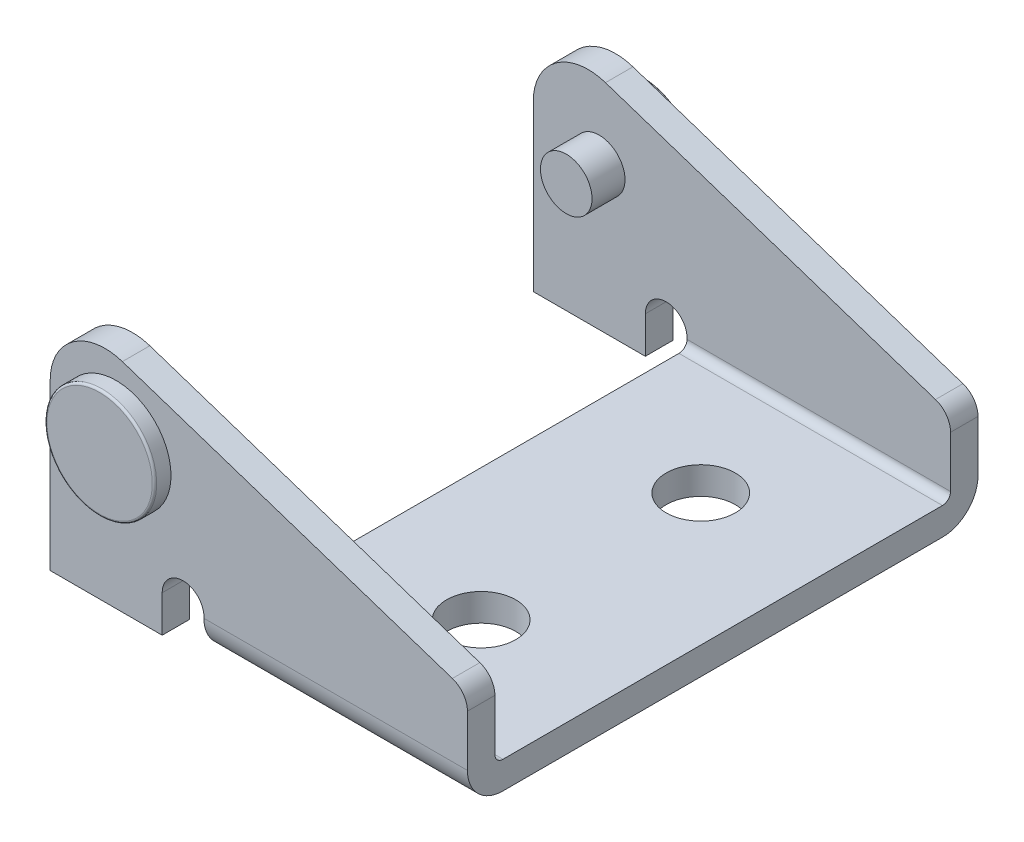
ISO-10303-21;
HEADER;
FILE_DESCRIPTION(('STEP AP214'),'2;1');
FILE_NAME('part.step','',(''),(''),'','','');
FILE_SCHEMA(('AUTOMOTIVE_DESIGN { 1 0 10303 214 1 1 1 1 }'));
ENDSEC;
DATA;
#1=APPLICATION_CONTEXT('core data for automotive mechanical design processes');
#2=APPLICATION_PROTOCOL_DEFINITION('international standard','automotive_design',2000,#1);
#3=PRODUCT_CONTEXT('',#1,'mechanical');
#4=PRODUCT('Part','Part','',(#3));
#5=PRODUCT_RELATED_PRODUCT_CATEGORY('part','',(#4));
#6=PRODUCT_DEFINITION_FORMATION('','',#4);
#7=PRODUCT_DEFINITION_CONTEXT('part definition',#1,'design');
#8=PRODUCT_DEFINITION('design','',#6,#7);
#9=PRODUCT_DEFINITION_SHAPE('','',#8);
#10=(LENGTH_UNIT() NAMED_UNIT(*) SI_UNIT(.MILLI.,.METRE.));
#11=(NAMED_UNIT(*) PLANE_ANGLE_UNIT() SI_UNIT($,.RADIAN.));
#12=(NAMED_UNIT(*) SI_UNIT($,.STERADIAN.) SOLID_ANGLE_UNIT());
#13=UNCERTAINTY_MEASURE_WITH_UNIT(LENGTH_MEASURE(1.E-05),#10,'distance_accuracy_value','');
#14=(GEOMETRIC_REPRESENTATION_CONTEXT(3) GLOBAL_UNCERTAINTY_ASSIGNED_CONTEXT((#13)) GLOBAL_UNIT_ASSIGNED_CONTEXT((#10,
#11,#12)) REPRESENTATION_CONTEXT('',''));
#15=CARTESIAN_POINT('',(0.,0.,0.));
#16=DIRECTION('',(0.,0.,1.));
#17=DIRECTION('',(1.,0.,0.));
#18=AXIS2_PLACEMENT_3D('',#15,#16,#17);
#19=CARTESIAN_POINT('',(-6.,-9.763,-20.013));
#20=DIRECTION('',(1.,0.,0.));
#21=DIRECTION('',(0.,0.,-1.));
#22=AXIS2_PLACEMENT_3D('',#19,#20,#21);
#23=PLANE('',#22);
#24=DIRECTION('',(0.,0.,-1.));
#25=VECTOR('',#24,1.);
#26=CARTESIAN_POINT('',(-6.,-13.,23.25));
#27=LINE('',#26,#25);
#28=CARTESIAN_POINT('',(-6.,-13.,-20.75));
#29=VERTEX_POINT('',#28);
#30=CARTESIAN_POINT('',(-6.,-13.,-23.25));
#31=VERTEX_POINT('',#30);
#32=EDGE_CURVE('E216',#29,#31,#27,.T.);
#33=ORIENTED_EDGE('',*,*,#32,.F.);
#34=DIRECTION('',(0.,-1.,0.));
#35=VECTOR('',#34,1.);
#36=CARTESIAN_POINT('',(-6.,7.03,-20.75));
#37=LINE('',#36,#35);
#38=CARTESIAN_POINT('',(-6.,2.024,-20.75));
#39=VERTEX_POINT('',#38);
#40=EDGE_CURVE('E222',#39,#29,#37,.T.);
#41=ORIENTED_EDGE('',*,*,#40,.F.);
#42=DIRECTION('',(0.,0.,-1.));
#43=VECTOR('',#42,1.);
#44=CARTESIAN_POINT('',(-6.,2.024,23.25));
#45=LINE('',#44,#43);
#46=CARTESIAN_POINT('',(-6.,2.024,-23.25));
#47=VERTEX_POINT('',#46);
#48=EDGE_CURVE('E246',#47,#39,#45,.F.);
#49=ORIENTED_EDGE('',*,*,#48,.F.);
#50=DIRECTION('',(0.,1.,0.));
#51=VECTOR('',#50,1.);
#52=CARTESIAN_POINT('',(-6.,-13.,-23.25));
#53=LINE('',#52,#51);
#54=EDGE_CURVE('E219',#31,#47,#53,.T.);
#55=ORIENTED_EDGE('',*,*,#54,.F.);
#56=EDGE_LOOP('',(#33,#41,#49,#55));
#57=FACE_BOUND('',#56,.T.);
#58=ADVANCED_FACE('F17',(#57),#23,.F.);
#59=DIRECTION('',(0.,1.,0.));
#60=VECTOR('',#59,1.);
#61=CARTESIAN_POINT('',(-6.,-9.763,20.75));
#62=LINE('',#61,#60);
#63=CARTESIAN_POINT('',(-6.,-13.,20.75));
#64=VERTEX_POINT('',#63);
#65=CARTESIAN_POINT('',(-6.,2.024,20.75));
#66=VERTEX_POINT('',#65);
#67=EDGE_CURVE('E224',#64,#66,#62,.T.);
#68=ORIENTED_EDGE('',*,*,#67,.F.);
#69=CARTESIAN_POINT('',(-6.,-13.,23.25));
#70=VERTEX_POINT('',#69);
#71=EDGE_CURVE('E199',#70,#64,#27,.T.);
#72=ORIENTED_EDGE('',*,*,#71,.F.);
#73=DIRECTION('',(0.,-1.,0.));
#74=VECTOR('',#73,1.);
#75=CARTESIAN_POINT('',(-6.,7.03,23.25));
#76=LINE('',#75,#74);
#77=CARTESIAN_POINT('',(-6.,2.024,23.25));
#78=VERTEX_POINT('',#77);
#79=EDGE_CURVE('E214',#78,#70,#76,.T.);
#80=ORIENTED_EDGE('',*,*,#79,.F.);
#81=DIRECTION('',(0.,0.,-1.));
#82=VECTOR('',#81,1.);
#83=CARTESIAN_POINT('',(-6.,2.024,23.25));
#84=LINE('',#83,#82);
#85=EDGE_CURVE('E348',#78,#66,#84,.T.);
#86=ORIENTED_EDGE('',*,*,#85,.T.);
#87=EDGE_LOOP('',(#68,#72,#80,#86));
#88=FACE_BOUND('',#87,.T.);
#89=ADVANCED_FACE('F405',(#88),#23,.F.);
#90=CARTESIAN_POINT('',(4.2,-13.,23.25));
#91=DIRECTION('',(0.,1.,0.));
#92=DIRECTION('',(0.,0.,1.));
#93=AXIS2_PLACEMENT_3D('',#90,#91,#92);
#94=PLANE('',#93);
#95=DIRECTION('',(1.,0.,0.));
#96=VECTOR('',#95,1.);
#97=CARTESIAN_POINT('',(4.2,-13.,-20.75));
#98=LINE('',#97,#96);
#99=CARTESIAN_POINT('',(4.2,-13.,-20.75));
#100=VERTEX_POINT('',#99);
#101=EDGE_CURVE('E200',#29,#100,#98,.T.);
#102=ORIENTED_EDGE('',*,*,#101,.F.);
#103=ORIENTED_EDGE('',*,*,#32,.T.);
#104=DIRECTION('',(-1.,0.,0.));
#105=VECTOR('',#104,1.);
#106=CARTESIAN_POINT('',(4.2,-13.,-23.25));
#107=LINE('',#106,#105);
#108=CARTESIAN_POINT('',(4.2,-13.,-23.25));
#109=VERTEX_POINT('',#108);
#110=EDGE_CURVE('E237',#109,#31,#107,.T.);
#111=ORIENTED_EDGE('',*,*,#110,.F.);
#112=DIRECTION('',(0.,0.,-1.));
#113=VECTOR('',#112,1.);
#114=CARTESIAN_POINT('',(4.2,-13.,23.25));
#115=LINE('',#114,#113);
#116=EDGE_CURVE('E207',#100,#109,#115,.T.);
#117=ORIENTED_EDGE('',*,*,#116,.F.);
#118=EDGE_LOOP('',(#102,#103,#111,#117));
#119=FACE_BOUND('',#118,.T.);
#120=ADVANCED_FACE('F442',(#119),#94,.F.);
#121=DIRECTION('',(-1.,0.,0.));
#122=VECTOR('',#121,1.);
#123=CARTESIAN_POINT('',(4.2,-13.,20.75));
#124=LINE('',#123,#122);
#125=CARTESIAN_POINT('',(4.2,-13.,20.75));
#126=VERTEX_POINT('',#125);
#127=EDGE_CURVE('E184',#126,#64,#124,.T.);
#128=ORIENTED_EDGE('',*,*,#127,.F.);
#129=CARTESIAN_POINT('',(4.2,-13.,23.25));
#130=VERTEX_POINT('',#129);
#131=EDGE_CURVE('E197',#130,#126,#115,.T.);
#132=ORIENTED_EDGE('',*,*,#131,.F.);
#133=DIRECTION('',(-1.,0.,0.));
#134=VECTOR('',#133,1.);
#135=CARTESIAN_POINT('',(4.2,-13.,23.25));
#136=LINE('',#135,#134);
#137=EDGE_CURVE('E240',#130,#70,#136,.T.);
#138=ORIENTED_EDGE('',*,*,#137,.T.);
#139=ORIENTED_EDGE('',*,*,#71,.T.);
#140=EDGE_LOOP('',(#128,#132,#138,#139));
#141=FACE_BOUND('',#140,.T.);
#142=ADVANCED_FACE('F195',(#141),#94,.F.);
#143=CARTESIAN_POINT('',(4.2,-9.763,-20.013));
#144=DIRECTION('',(1.,0.,0.));
#145=DIRECTION('',(0.,0.,-1.));
#146=AXIS2_PLACEMENT_3D('',#143,#144,#145);
#147=PLANE('',#146);
#148=DIRECTION('',(0.,1.,0.));
#149=VECTOR('',#148,1.);
#150=CARTESIAN_POINT('',(4.20000000000006,7.03,-20.75));
#151=LINE('',#150,#149);
#152=CARTESIAN_POINT('',(4.2,-9.647,-20.75));
#153=VERTEX_POINT('',#152);
#154=EDGE_CURVE('E32',#100,#153,#151,.T.);
#155=ORIENTED_EDGE('',*,*,#154,.F.);
#156=ORIENTED_EDGE('',*,*,#116,.T.);
#157=DIRECTION('',(0.,1.,0.));
#158=VECTOR('',#157,1.);
#159=CARTESIAN_POINT('',(4.2,-13.,-23.25));
#160=LINE('',#159,#158);
#161=CARTESIAN_POINT('',(4.2,-9.647,-23.25));
#162=VERTEX_POINT('',#161);
#163=EDGE_CURVE('E206',#109,#162,#160,.T.);
#164=ORIENTED_EDGE('',*,*,#163,.T.);
#165=DIRECTION('',(0.,0.,-1.));
#166=VECTOR('',#165,1.);
#167=CARTESIAN_POINT('',(4.2,-9.647,23.25));
#168=LINE('',#167,#166);
#169=EDGE_CURVE('E381',#153,#162,#168,.T.);
#170=ORIENTED_EDGE('',*,*,#169,.F.);
#171=EDGE_LOOP('',(#155,#156,#164,#170));
#172=FACE_BOUND('',#171,.T.);
#173=ADVANCED_FACE('F446',(#172),#147,.T.);
#174=ORIENTED_EDGE('',*,*,#131,.T.);
#175=DIRECTION('',(0.,-1.,0.));
#176=VECTOR('',#175,1.);
#177=CARTESIAN_POINT('',(4.2,-9.763,20.75));
#178=LINE('',#177,#176);
#179=CARTESIAN_POINT('',(4.2,-9.647,20.75));
#180=VERTEX_POINT('',#179);
#181=EDGE_CURVE('E180',#180,#126,#178,.T.);
#182=ORIENTED_EDGE('',*,*,#181,.F.);
#183=CARTESIAN_POINT('',(4.2,-9.647,23.25));
#184=VERTEX_POINT('',#183);
#185=EDGE_CURVE('E379',#184,#180,#168,.T.);
#186=ORIENTED_EDGE('',*,*,#185,.F.);
#187=DIRECTION('',(0.,-1.,0.));
#188=VECTOR('',#187,1.);
#189=CARTESIAN_POINT('',(4.2,7.03,23.25));
#190=LINE('',#189,#188);
#191=EDGE_CURVE('E204',#184,#130,#190,.T.);
#192=ORIENTED_EDGE('',*,*,#191,.T.);
#193=EDGE_LOOP('',(#174,#182,#186,#192));
#194=FACE_BOUND('',#193,.T.);
#195=ADVANCED_FACE('F203',(#194),#147,.T.);
#196=CARTESIAN_POINT('',(20.,-13.,10.));
#197=DIRECTION('',(0.,1.,0.));
#198=DIRECTION('',(1.,0.,0.));
#199=AXIS2_PLACEMENT_3D('',#196,#197,#198);
#200=CIRCLE('',#199,3.15);
#201=CARTESIAN_POINT('',(23.15,-13.,10.));
#202=VERTEX_POINT('',#201);
#203=EDGE_CURVE('E478',#202,#202,#200,.T.);
#204=ORIENTED_EDGE('',*,*,#203,.T.);
#205=EDGE_LOOP('',(#204));
#206=FACE_BOUND('',#205,.T.);
#207=CARTESIAN_POINT('',(20.,-13.,-10.));
#208=DIRECTION('',(0.,1.,0.));
#209=DIRECTION('',(1.,0.,0.));
#210=AXIS2_PLACEMENT_3D('',#207,#208,#209);
#211=CIRCLE('',#210,3.15);
#212=CARTESIAN_POINT('',(23.15,-13.,-10.));
#213=VERTEX_POINT('',#212);
#214=EDGE_CURVE('E201',#213,#213,#211,.T.);
#215=ORIENTED_EDGE('',*,*,#214,.T.);
#216=EDGE_LOOP('',(#215));
#217=FACE_BOUND('',#216,.T.);
#218=DIRECTION('',(-1.,0.,0.));
#219=VECTOR('',#218,1.);
#220=CARTESIAN_POINT('',(32.,-13.,20.013));
#221=LINE('',#220,#219);
#222=CARTESIAN_POINT('',(32.,-13.,20.013));
#223=VERTEX_POINT('',#222);
#224=CARTESIAN_POINT('',(8.,-13.,20.013));
#225=VERTEX_POINT('',#224);
#226=EDGE_CURVE('E314',#223,#225,#221,.T.);
#227=ORIENTED_EDGE('',*,*,#226,.T.);
#228=DIRECTION('',(0.,0.,-1.));
#229=VECTOR('',#228,1.);
#230=CARTESIAN_POINT('',(8.,-13.,23.25));
#231=LINE('',#230,#229);
#232=CARTESIAN_POINT('',(8.,-13.,-20.013));
#233=VERTEX_POINT('',#232);
#234=EDGE_CURVE('E373',#225,#233,#231,.T.);
#235=ORIENTED_EDGE('',*,*,#234,.T.);
#236=DIRECTION('',(-1.,0.,0.));
#237=VECTOR('',#236,1.);
#238=CARTESIAN_POINT('',(32.,-13.,-20.013));
#239=LINE('',#238,#237);
#240=CARTESIAN_POINT('',(32.,-13.,-20.013));
#241=VERTEX_POINT('',#240);
#242=EDGE_CURVE('E311',#241,#233,#239,.T.);
#243=ORIENTED_EDGE('',*,*,#242,.F.);
#244=DIRECTION('',(0.,0.,-1.));
#245=VECTOR('',#244,1.);
#246=CARTESIAN_POINT('',(32.,-13.,20.013));
#247=LINE('',#246,#245);
#248=EDGE_CURVE('E287',#223,#241,#247,.T.);
#249=ORIENTED_EDGE('',*,*,#248,.F.);
#250=EDGE_LOOP('',(#227,#235,#243,#249));
#251=FACE_BOUND('',#250,.T.);
#252=ADVANCED_FACE('F459',(#206,#217,#251),#94,.F.);
#253=CARTESIAN_POINT('',(4.2,-9.763,-20.013));
#254=DIRECTION('',(-1.,0.,0.));
#255=DIRECTION('',(0.,0.,1.));
#256=AXIS2_PLACEMENT_3D('',#253,#254,#255);
#257=CYLINDRICAL_SURFACE('',#256,0.737000000000002);
#258=CARTESIAN_POINT('',(8.,-9.763,-20.013));
#259=DIRECTION('',(1.,0.,0.));
#260=DIRECTION('',(0.,0.,-1.));
#261=AXIS2_PLACEMENT_3D('',#258,#259,#260);
#262=CIRCLE('',#261,0.737000000000002);
#263=CARTESIAN_POINT('',(8.,-10.5,-20.013));
#264=VERTEX_POINT('',#263);
#265=CARTESIAN_POINT('',(8.,-9.763,-20.75));
#266=VERTEX_POINT('',#265);
#267=EDGE_CURVE('E396',#264,#266,#262,.T.);
#268=ORIENTED_EDGE('',*,*,#267,.F.);
#269=DIRECTION('',(-1.,0.,0.));
#270=VECTOR('',#269,1.);
#271=CARTESIAN_POINT('',(4.2,-10.5,-20.013));
#272=LINE('',#271,#270);
#273=CARTESIAN_POINT('',(32.,-10.5,-20.013));
#274=VERTEX_POINT('',#273);
#275=EDGE_CURVE('E231',#274,#264,#272,.T.);
#276=ORIENTED_EDGE('',*,*,#275,.F.);
#277=CARTESIAN_POINT('',(32.,-9.763,-20.013));
#278=DIRECTION('',(1.,0.,0.));
#279=DIRECTION('',(0.,0.,-1.));
#280=AXIS2_PLACEMENT_3D('',#277,#278,#279);
#281=CIRCLE('',#280,0.737000000000002);
#282=CARTESIAN_POINT('',(32.,-9.763,-20.75));
#283=VERTEX_POINT('',#282);
#284=EDGE_CURVE('E296',#274,#283,#281,.T.);
#285=ORIENTED_EDGE('',*,*,#284,.T.);
#286=DIRECTION('',(-1.,0.,0.));
#287=VECTOR('',#286,1.);
#288=CARTESIAN_POINT('',(4.2,-9.763,-20.75));
#289=LINE('',#288,#287);
#290=EDGE_CURVE('E234',#283,#266,#289,.T.);
#291=ORIENTED_EDGE('',*,*,#290,.T.);
#292=EDGE_LOOP('',(#268,#276,#285,#291));
#293=FACE_BOUND('',#292,.T.);
#294=ADVANCED_FACE('F456',(#293),#257,.F.);
#295=CARTESIAN_POINT('',(4.2,-10.5,-20.013));
#296=DIRECTION('',(0.,-1.,0.));
#297=DIRECTION('',(0.,0.,-1.));
#298=AXIS2_PLACEMENT_3D('',#295,#296,#297);
#299=PLANE('',#298);
#300=CARTESIAN_POINT('',(20.,-10.5,10.));
#301=DIRECTION('',(0.,1.,0.));
#302=DIRECTION('',(1.,0.,0.));
#303=AXIS2_PLACEMENT_3D('',#300,#301,#302);
#304=CIRCLE('',#303,3.15);
#305=CARTESIAN_POINT('',(23.15,-10.5,10.));
#306=VERTEX_POINT('',#305);
#307=EDGE_CURVE('E515',#306,#306,#304,.T.);
#308=ORIENTED_EDGE('',*,*,#307,.F.);
#309=EDGE_LOOP('',(#308));
#310=FACE_BOUND('',#309,.T.);
#311=CARTESIAN_POINT('',(20.,-10.5,-10.));
#312=DIRECTION('',(0.,1.,0.));
#313=DIRECTION('',(1.,0.,0.));
#314=AXIS2_PLACEMENT_3D('',#311,#312,#313);
#315=CIRCLE('',#314,3.15);
#316=CARTESIAN_POINT('',(23.15,-10.5,-10.));
#317=VERTEX_POINT('',#316);
#318=EDGE_CURVE('E511',#317,#317,#315,.T.);
#319=ORIENTED_EDGE('',*,*,#318,.F.);
#320=EDGE_LOOP('',(#319));
#321=FACE_BOUND('',#320,.T.);
#322=ORIENTED_EDGE('',*,*,#275,.T.);
#323=DIRECTION('',(0.,0.,1.));
#324=VECTOR('',#323,1.);
#325=CARTESIAN_POINT('',(8.,-10.5,-20.013));
#326=LINE('',#325,#324);
#327=CARTESIAN_POINT('',(8.,-10.5,20.013));
#328=VERTEX_POINT('',#327);
#329=EDGE_CURVE('E393',#264,#328,#326,.T.);
#330=ORIENTED_EDGE('',*,*,#329,.T.);
#331=DIRECTION('',(-1.,0.,0.));
#332=VECTOR('',#331,1.);
#333=CARTESIAN_POINT('',(4.2,-10.5,20.013));
#334=LINE('',#333,#332);
#335=CARTESIAN_POINT('',(32.,-10.5,20.013));
#336=VERTEX_POINT('',#335);
#337=EDGE_CURVE('E228',#336,#328,#334,.T.);
#338=ORIENTED_EDGE('',*,*,#337,.F.);
#339=DIRECTION('',(0.,0.,1.));
#340=VECTOR('',#339,1.);
#341=CARTESIAN_POINT('',(32.,-10.5,-20.013));
#342=LINE('',#341,#340);
#343=EDGE_CURVE('E299',#274,#336,#342,.T.);
#344=ORIENTED_EDGE('',*,*,#343,.F.);
#345=EDGE_LOOP('',(#322,#330,#338,#344));
#346=FACE_BOUND('',#345,.T.);
#347=ADVANCED_FACE('F453',(#310,#321,#346),#299,.F.);
#348=CARTESIAN_POINT('',(4.2,-9.763,20.013));
#349=DIRECTION('',(-1.,0.,0.));
#350=DIRECTION('',(0.,0.,1.));
#351=AXIS2_PLACEMENT_3D('',#348,#349,#350);
#352=CYLINDRICAL_SURFACE('',#351,0.737000000000002);
#353=CARTESIAN_POINT('',(8.,-9.763,20.013));
#354=DIRECTION('',(1.,0.,0.));
#355=DIRECTION('',(0.,0.,-1.));
#356=AXIS2_PLACEMENT_3D('',#353,#354,#355);
#357=CIRCLE('',#356,0.737000000000002);
#358=CARTESIAN_POINT('',(8.,-9.763,20.75));
#359=VERTEX_POINT('',#358);
#360=EDGE_CURVE('E391',#359,#328,#357,.T.);
#361=ORIENTED_EDGE('',*,*,#360,.F.);
#362=DIRECTION('',(-1.,0.,0.));
#363=VECTOR('',#362,1.);
#364=CARTESIAN_POINT('',(4.2,-9.763,20.75));
#365=LINE('',#364,#363);
#366=CARTESIAN_POINT('',(32.,-9.763,20.75));
#367=VERTEX_POINT('',#366);
#368=EDGE_CURVE('E209',#367,#359,#365,.T.);
#369=ORIENTED_EDGE('',*,*,#368,.F.);
#370=CARTESIAN_POINT('',(32.,-9.763,20.013));
#371=DIRECTION('',(1.,0.,0.));
#372=DIRECTION('',(0.,0.,-1.));
#373=AXIS2_PLACEMENT_3D('',#370,#371,#372);
#374=CIRCLE('',#373,0.737000000000002);
#375=EDGE_CURVE('E302',#367,#336,#374,.T.);
#376=ORIENTED_EDGE('',*,*,#375,.T.);
#377=ORIENTED_EDGE('',*,*,#337,.T.);
#378=EDGE_LOOP('',(#361,#369,#376,#377));
#379=FACE_BOUND('',#378,.T.);
#380=ADVANCED_FACE('F420',(#379),#352,.F.);
#381=CARTESIAN_POINT('',(32.,-9.76299999999999,20.013));
#382=DIRECTION('',(1.,0.,0.));
#383=DIRECTION('',(0.,0.,-1.));
#384=AXIS2_PLACEMENT_3D('',#381,#382,#383);
#385=PLANE('',#384);
#386=DIRECTION('',(0.,1.,0.));
#387=VECTOR('',#386,1.);
#388=CARTESIAN_POINT('',(32.,-9.763,-23.25));
#389=LINE('',#388,#387);
#390=CARTESIAN_POINT('',(32.,-9.763,-23.25));
#391=VERTEX_POINT('',#390);
#392=CARTESIAN_POINT('',(32.,-5.092,-23.25));
#393=VERTEX_POINT('',#392);
#394=EDGE_CURVE('E291',#391,#393,#389,.T.);
#395=ORIENTED_EDGE('',*,*,#394,.T.);
#396=DIRECTION('',(0.,0.,-1.));
#397=VECTOR('',#396,1.);
#398=CARTESIAN_POINT('',(32.,-5.092,23.25));
#399=LINE('',#398,#397);
#400=CARTESIAN_POINT('',(32.,-5.092,-20.75));
#401=VERTEX_POINT('',#400);
#402=EDGE_CURVE('E242',#393,#401,#399,.F.);
#403=ORIENTED_EDGE('',*,*,#402,.T.);
#404=DIRECTION('',(0.,-1.,0.));
#405=VECTOR('',#404,1.);
#406=CARTESIAN_POINT('',(32.,7.03,-20.75));
#407=LINE('',#406,#405);
#408=EDGE_CURVE('E294',#401,#283,#407,.T.);
#409=ORIENTED_EDGE('',*,*,#408,.T.);
#410=ORIENTED_EDGE('',*,*,#284,.F.);
#411=ORIENTED_EDGE('',*,*,#343,.T.);
#412=ORIENTED_EDGE('',*,*,#375,.F.);
#413=DIRECTION('',(0.,1.,0.));
#414=VECTOR('',#413,1.);
#415=CARTESIAN_POINT('',(32.,-9.763,20.75));
#416=LINE('',#415,#414);
#417=CARTESIAN_POINT('',(32.,-5.092,20.75));
#418=VERTEX_POINT('',#417);
#419=EDGE_CURVE('E305',#367,#418,#416,.T.);
#420=ORIENTED_EDGE('',*,*,#419,.T.);
#421=DIRECTION('',(0.,0.,-1.));
#422=VECTOR('',#421,1.);
#423=CARTESIAN_POINT('',(32.,-5.092,23.25));
#424=LINE('',#423,#422);
#425=CARTESIAN_POINT('',(32.,-5.092,23.25));
#426=VERTEX_POINT('',#425);
#427=EDGE_CURVE('E371',#426,#418,#424,.T.);
#428=ORIENTED_EDGE('',*,*,#427,.F.);
#429=DIRECTION('',(0.,-1.,0.));
#430=VECTOR('',#429,1.);
#431=CARTESIAN_POINT('',(32.,7.03,23.25));
#432=LINE('',#431,#430);
#433=CARTESIAN_POINT('',(32.,-9.763,23.25));
#434=VERTEX_POINT('',#433);
#435=EDGE_CURVE('E277',#426,#434,#432,.T.);
#436=ORIENTED_EDGE('',*,*,#435,.T.);
#437=CARTESIAN_POINT('',(32.,-9.76299999999999,20.013));
#438=DIRECTION('',(1.,0.,0.));
#439=DIRECTION('',(0.,0.,-1.));
#440=AXIS2_PLACEMENT_3D('',#437,#438,#439);
#441=CIRCLE('',#440,3.23700000000001);
#442=EDGE_CURVE('E285',#434,#223,#441,.T.);
#443=ORIENTED_EDGE('',*,*,#442,.T.);
#444=ORIENTED_EDGE('',*,*,#248,.T.);
#445=CARTESIAN_POINT('',(32.,-9.763,-20.013));
#446=DIRECTION('',(1.,0.,0.));
#447=DIRECTION('',(0.,0.,-1.));
#448=AXIS2_PLACEMENT_3D('',#445,#446,#447);
#449=CIRCLE('',#448,3.237);
#450=EDGE_CURVE('E289',#241,#391,#449,.T.);
#451=ORIENTED_EDGE('',*,*,#450,.T.);
#452=EDGE_LOOP('',(#395,#403,#409,#410,#411,#412,#420,#428,#436,#443,#444,#451));
#453=FACE_BOUND('',#452,.T.);
#454=ADVANCED_FACE('F415',(#453),#385,.T.);
#455=CARTESIAN_POINT('',(4.2,7.03,23.25));
#456=DIRECTION('',(0.,0.,-1.));
#457=DIRECTION('',(-1.,0.,0.));
#458=AXIS2_PLACEMENT_3D('',#455,#456,#457);
#459=PLANE('',#458);
#460=CARTESIAN_POINT('',(0.,0.,23.25));
#461=DIRECTION('',(0.,0.,-1.));
#462=DIRECTION('',(-1.,0.,0.));
#463=AXIS2_PLACEMENT_3D('',#460,#461,#462);
#464=CIRCLE('',#463,5.);
#465=CARTESIAN_POINT('',(-5.,0.,23.25));
#466=VERTEX_POINT('',#465);
#467=EDGE_CURVE('E254',#466,#466,#464,.F.);
#468=ORIENTED_EDGE('',*,*,#467,.F.);
#469=EDGE_LOOP('',(#468));
#470=FACE_BOUND('',#469,.T.);
#471=DIRECTION('',(-0.949203664564759,0.314662363775575,0.));
#472=VECTOR('',#471,1.);
#473=CARTESIAN_POINT('',(30.6293247275512,-3.19359267087048,23.25));
#474=LINE('',#473,#472);
#475=CARTESIAN_POINT('',(30.6293247275512,-3.19359267087049,23.25));
#476=VERTEX_POINT('',#475);
#477=CARTESIAN_POINT('',(0.573311818877875,6.7700183228238,23.25));
#478=VERTEX_POINT('',#477);
#479=EDGE_CURVE('E338',#476,#478,#474,.T.);
#480=ORIENTED_EDGE('',*,*,#479,.T.);
#481=CARTESIAN_POINT('',(-0.999999999999999,2.024,23.25));
#482=DIRECTION('',(0.,0.,1.));
#483=DIRECTION('',(1.,0.,0.));
#484=AXIS2_PLACEMENT_3D('',#481,#482,#483);
#485=CIRCLE('',#484,5.);
#486=EDGE_CURVE('E345',#478,#78,#485,.T.);
#487=ORIENTED_EDGE('',*,*,#486,.T.);
#488=ORIENTED_EDGE('',*,*,#79,.T.);
#489=ORIENTED_EDGE('',*,*,#137,.F.);
#490=ORIENTED_EDGE('',*,*,#191,.F.);
#491=CARTESIAN_POINT('',(6.1,-9.647,23.25));
#492=DIRECTION('',(0.,0.,1.));
#493=DIRECTION('',(1.,0.,0.));
#494=AXIS2_PLACEMENT_3D('',#491,#492,#493);
#495=CIRCLE('',#494,1.9);
#496=CARTESIAN_POINT('',(8.,-9.647,23.25));
#497=VERTEX_POINT('',#496);
#498=EDGE_CURVE('E333',#497,#184,#495,.T.);
#499=ORIENTED_EDGE('',*,*,#498,.F.);
#500=DIRECTION('',(0.,-1.,0.));
#501=VECTOR('',#500,1.);
#502=CARTESIAN_POINT('',(8.,-9.647,23.25));
#503=LINE('',#502,#501);
#504=CARTESIAN_POINT('',(8.,-9.76299999999999,23.25));
#505=VERTEX_POINT('',#504);
#506=EDGE_CURVE('E331',#497,#505,#503,.T.);
#507=ORIENTED_EDGE('',*,*,#506,.T.);
#508=DIRECTION('',(-1.,0.,0.));
#509=VECTOR('',#508,1.);
#510=CARTESIAN_POINT('',(32.,-9.763,23.25));
#511=LINE('',#510,#509);
#512=EDGE_CURVE('E217',#434,#505,#511,.T.);
#513=ORIENTED_EDGE('',*,*,#512,.F.);
#514=ORIENTED_EDGE('',*,*,#435,.F.);
#515=CARTESIAN_POINT('',(30.,-5.092,23.25));
#516=DIRECTION('',(0.,0.,1.));
#517=DIRECTION('',(1.,0.,0.));
#518=AXIS2_PLACEMENT_3D('',#515,#516,#517);
#519=CIRCLE('',#518,1.99999999999999);
#520=EDGE_CURVE('E336',#426,#476,#519,.T.);
#521=ORIENTED_EDGE('',*,*,#520,.T.);
#522=EDGE_LOOP('',(#480,#487,#488,#489,#490,#499,#507,#513,#514,#521));
#523=FACE_BOUND('',#522,.T.);
#524=ADVANCED_FACE('F19',(#470,#523),#459,.F.);
#525=CARTESIAN_POINT('',(4.2,-13.,-23.25));
#526=DIRECTION('',(0.,0.,1.));
#527=DIRECTION('',(1.,0.,0.));
#528=AXIS2_PLACEMENT_3D('',#525,#526,#527);
#529=PLANE('',#528);
#530=CARTESIAN_POINT('',(0.,0.,-23.25));
#531=DIRECTION('',(0.,0.,1.));
#532=DIRECTION('',(1.,0.,0.));
#533=AXIS2_PLACEMENT_3D('',#530,#531,#532);
#534=CIRCLE('',#533,5.);
#535=CARTESIAN_POINT('',(5.,0.,-23.25));
#536=VERTEX_POINT('',#535);
#537=EDGE_CURVE('E11',#536,#536,#534,.F.);
#538=ORIENTED_EDGE('',*,*,#537,.F.);
#539=EDGE_LOOP('',(#538));
#540=FACE_BOUND('',#539,.T.);
#541=ORIENTED_EDGE('',*,*,#54,.T.);
#542=CARTESIAN_POINT('',(-0.999999999999999,2.024,-23.25));
#543=DIRECTION('',(0.,0.,1.));
#544=DIRECTION('',(1.,0.,0.));
#545=AXIS2_PLACEMENT_3D('',#542,#543,#544);
#546=CIRCLE('',#545,5.);
#547=CARTESIAN_POINT('',(0.573311818877875,6.7700183228238,-23.25));
#548=VERTEX_POINT('',#547);
#549=EDGE_CURVE('E340',#548,#47,#546,.T.);
#550=ORIENTED_EDGE('',*,*,#549,.F.);
#551=DIRECTION('',(-0.949203664564759,0.314662363775575,0.));
#552=VECTOR('',#551,1.);
#553=CARTESIAN_POINT('',(30.6293247275512,-3.19359267087048,-23.25));
#554=LINE('',#553,#552);
#555=CARTESIAN_POINT('',(30.6293247275512,-3.19359267087049,-23.25));
#556=VERTEX_POINT('',#555);
#557=EDGE_CURVE('E358',#556,#548,#554,.T.);
#558=ORIENTED_EDGE('',*,*,#557,.F.);
#559=CARTESIAN_POINT('',(30.,-5.092,-23.25));
#560=DIRECTION('',(0.,0.,1.));
#561=DIRECTION('',(1.,0.,0.));
#562=AXIS2_PLACEMENT_3D('',#559,#560,#561);
#563=CIRCLE('',#562,1.99999999999999);
#564=EDGE_CURVE('E355',#393,#556,#563,.T.);
#565=ORIENTED_EDGE('',*,*,#564,.F.);
#566=ORIENTED_EDGE('',*,*,#394,.F.);
#567=DIRECTION('',(-1.,0.,0.));
#568=VECTOR('',#567,1.);
#569=CARTESIAN_POINT('',(32.,-9.763,-23.25));
#570=LINE('',#569,#568);
#571=CARTESIAN_POINT('',(8.,-9.763,-23.25));
#572=VERTEX_POINT('',#571);
#573=EDGE_CURVE('E308',#391,#572,#570,.T.);
#574=ORIENTED_EDGE('',*,*,#573,.T.);
#575=DIRECTION('',(0.,-1.,0.));
#576=VECTOR('',#575,1.);
#577=CARTESIAN_POINT('',(8.,-9.647,-23.25));
#578=LINE('',#577,#576);
#579=CARTESIAN_POINT('',(8.,-9.647,-23.25));
#580=VERTEX_POINT('',#579);
#581=EDGE_CURVE('E352',#580,#572,#578,.T.);
#582=ORIENTED_EDGE('',*,*,#581,.F.);
#583=CARTESIAN_POINT('',(6.1,-9.647,-23.25));
#584=DIRECTION('',(0.,0.,1.));
#585=DIRECTION('',(1.,0.,0.));
#586=AXIS2_PLACEMENT_3D('',#583,#584,#585);
#587=CIRCLE('',#586,1.9);
#588=EDGE_CURVE('E349',#580,#162,#587,.T.);
#589=ORIENTED_EDGE('',*,*,#588,.T.);
#590=ORIENTED_EDGE('',*,*,#163,.F.);
#591=ORIENTED_EDGE('',*,*,#110,.T.);
#592=EDGE_LOOP('',(#541,#550,#558,#565,#566,#574,#582,#589,#590,#591));
#593=FACE_BOUND('',#592,.T.);
#594=ADVANCED_FACE('F264',(#540,#593),#529,.F.);
#595=CARTESIAN_POINT('',(4.2,7.03,-20.75));
#596=DIRECTION('',(0.,0.,-1.));
#597=DIRECTION('',(-1.,0.,0.));
#598=AXIS2_PLACEMENT_3D('',#595,#596,#597);
#599=PLANE('',#598);
#600=CARTESIAN_POINT('',(0.,0.,-20.75));
#601=DIRECTION('',(0.,0.,-1.));
#602=DIRECTION('',(-1.,0.,0.));
#603=AXIS2_PLACEMENT_3D('',#600,#601,#602);
#604=CIRCLE('',#603,2.35);
#605=CARTESIAN_POINT('',(-2.35,0.,-20.75));
#606=VERTEX_POINT('',#605);
#607=EDGE_CURVE('E25',#606,#606,#604,.F.);
#608=ORIENTED_EDGE('',*,*,#607,.F.);
#609=EDGE_LOOP('',(#608));
#610=FACE_BOUND('',#609,.T.);
#611=CARTESIAN_POINT('',(6.1,-9.647,-20.75));
#612=DIRECTION('',(0.,0.,-1.));
#613=DIRECTION('',(-1.,0.,0.));
#614=AXIS2_PLACEMENT_3D('',#611,#612,#613);
#615=CIRCLE('',#614,1.9);
#616=CARTESIAN_POINT('',(8.,-9.647,-20.75));
#617=VERTEX_POINT('',#616);
#618=EDGE_CURVE('E268',#617,#153,#615,.F.);
#619=ORIENTED_EDGE('',*,*,#618,.F.);
#620=DIRECTION('',(0.,-1.,0.));
#621=VECTOR('',#620,1.);
#622=CARTESIAN_POINT('',(8.,7.03,-20.75));
#623=LINE('',#622,#621);
#624=EDGE_CURVE('E270',#617,#266,#623,.T.);
#625=ORIENTED_EDGE('',*,*,#624,.T.);
#626=ORIENTED_EDGE('',*,*,#290,.F.);
#627=ORIENTED_EDGE('',*,*,#408,.F.);
#628=CARTESIAN_POINT('',(30.,-5.092,-20.75));
#629=DIRECTION('',(0.,0.,-1.));
#630=DIRECTION('',(-1.,0.,0.));
#631=AXIS2_PLACEMENT_3D('',#628,#629,#630);
#632=CIRCLE('',#631,1.99999999999999);
#633=CARTESIAN_POINT('',(30.6293247275512,-3.19359267087049,-20.75));
#634=VERTEX_POINT('',#633);
#635=EDGE_CURVE('E40',#401,#634,#632,.F.);
#636=ORIENTED_EDGE('',*,*,#635,.T.);
#637=DIRECTION('',(-0.949203664564759,0.314662363775575,0.));
#638=VECTOR('',#637,1.);
#639=CARTESIAN_POINT('',(3.76326190636364,5.71254533538582,-20.75));
#640=LINE('',#639,#638);
#641=CARTESIAN_POINT('',(0.573311818877875,6.7700183228238,-20.75));
#642=VERTEX_POINT('',#641);
#643=EDGE_CURVE('E274',#634,#642,#640,.T.);
#644=ORIENTED_EDGE('',*,*,#643,.T.);
#645=CARTESIAN_POINT('',(-0.999999999999999,2.024,-20.75));
#646=DIRECTION('',(0.,0.,-1.));
#647=DIRECTION('',(-1.,0.,0.));
#648=AXIS2_PLACEMENT_3D('',#645,#646,#647);
#649=CIRCLE('',#648,5.);
#650=EDGE_CURVE('E275',#642,#39,#649,.F.);
#651=ORIENTED_EDGE('',*,*,#650,.T.);
#652=ORIENTED_EDGE('',*,*,#40,.T.);
#653=ORIENTED_EDGE('',*,*,#101,.T.);
#654=ORIENTED_EDGE('',*,*,#154,.T.);
#655=EDGE_LOOP('',(#619,#625,#626,#627,#636,#644,#651,#652,#653,#654));
#656=FACE_BOUND('',#655,.T.);
#657=ADVANCED_FACE('F261',(#610,#656),#599,.F.);
#658=CARTESIAN_POINT('',(4.2,-9.763,20.75));
#659=DIRECTION('',(0.,0.,1.));
#660=DIRECTION('',(1.,0.,0.));
#661=AXIS2_PLACEMENT_3D('',#658,#659,#660);
#662=PLANE('',#661);
#663=CARTESIAN_POINT('',(0.,0.,20.75));
#664=DIRECTION('',(0.,0.,1.));
#665=DIRECTION('',(1.,0.,0.));
#666=AXIS2_PLACEMENT_3D('',#663,#664,#665);
#667=CIRCLE('',#666,2.35);
#668=CARTESIAN_POINT('',(2.35,0.,20.75));
#669=VERTEX_POINT('',#668);
#670=EDGE_CURVE('E251',#669,#669,#667,.F.);
#671=ORIENTED_EDGE('',*,*,#670,.F.);
#672=EDGE_LOOP('',(#671));
#673=FACE_BOUND('',#672,.T.);
#674=DIRECTION('',(0.949203664564759,-0.314662363775575,0.));
#675=VECTOR('',#674,1.);
#676=CARTESIAN_POINT('',(8.77897279146134,4.04983004883727,20.75));
#677=LINE('',#676,#675);
#678=CARTESIAN_POINT('',(0.573311818877875,6.7700183228238,20.75));
#679=VERTEX_POINT('',#678);
#680=CARTESIAN_POINT('',(30.6293247275512,-3.19359267087049,20.75));
#681=VERTEX_POINT('',#680);
#682=EDGE_CURVE('E249',#679,#681,#677,.T.);
#683=ORIENTED_EDGE('',*,*,#682,.T.);
#684=CARTESIAN_POINT('',(30.,-5.092,20.75));
#685=DIRECTION('',(0.,0.,1.));
#686=DIRECTION('',(1.,0.,0.));
#687=AXIS2_PLACEMENT_3D('',#684,#685,#686);
#688=CIRCLE('',#687,1.99999999999999);
#689=EDGE_CURVE('E365',#681,#418,#688,.F.);
#690=ORIENTED_EDGE('',*,*,#689,.T.);
#691=ORIENTED_EDGE('',*,*,#419,.F.);
#692=ORIENTED_EDGE('',*,*,#368,.T.);
#693=DIRECTION('',(0.,1.,0.));
#694=VECTOR('',#693,1.);
#695=CARTESIAN_POINT('',(8.,-9.763,20.75));
#696=LINE('',#695,#694);
#697=CARTESIAN_POINT('',(8.,-9.647,20.75));
#698=VERTEX_POINT('',#697);
#699=EDGE_CURVE('E389',#359,#698,#696,.T.);
#700=ORIENTED_EDGE('',*,*,#699,.T.);
#701=CARTESIAN_POINT('',(6.1,-9.647,20.75));
#702=DIRECTION('',(0.,0.,1.));
#703=DIRECTION('',(1.,0.,0.));
#704=AXIS2_PLACEMENT_3D('',#701,#702,#703);
#705=CIRCLE('',#704,1.9);
#706=EDGE_CURVE('E187',#180,#698,#705,.F.);
#707=ORIENTED_EDGE('',*,*,#706,.F.);
#708=ORIENTED_EDGE('',*,*,#181,.T.);
#709=ORIENTED_EDGE('',*,*,#127,.T.);
#710=ORIENTED_EDGE('',*,*,#67,.T.);
#711=CARTESIAN_POINT('',(-0.999999999999999,2.024,20.75));
#712=DIRECTION('',(0.,0.,1.));
#713=DIRECTION('',(1.,0.,0.));
#714=AXIS2_PLACEMENT_3D('',#711,#712,#713);
#715=CIRCLE('',#714,5.);
#716=EDGE_CURVE('E280',#66,#679,#715,.F.);
#717=ORIENTED_EDGE('',*,*,#716,.T.);
#718=EDGE_LOOP('',(#683,#690,#691,#692,#700,#707,#708,#709,#710,#717));
#719=FACE_BOUND('',#718,.T.);
#720=ADVANCED_FACE('F182',(#673,#719),#662,.F.);
#721=CARTESIAN_POINT('',(32.,-9.76299999999999,20.013));
#722=DIRECTION('',(-1.,0.,0.));
#723=DIRECTION('',(0.,0.,1.));
#724=AXIS2_PLACEMENT_3D('',#721,#722,#723);
#725=CYLINDRICAL_SURFACE('',#724,3.23700000000001);
#726=ORIENTED_EDGE('',*,*,#512,.T.);
#727=CARTESIAN_POINT('',(8.,-9.76299999999999,20.013));
#728=DIRECTION('',(1.,0.,0.));
#729=DIRECTION('',(0.,0.,-1.));
#730=AXIS2_PLACEMENT_3D('',#727,#728,#729);
#731=CIRCLE('',#730,3.23700000000001);
#732=EDGE_CURVE('E322',#505,#225,#731,.T.);
#733=ORIENTED_EDGE('',*,*,#732,.T.);
#734=ORIENTED_EDGE('',*,*,#226,.F.);
#735=ORIENTED_EDGE('',*,*,#442,.F.);
#736=EDGE_LOOP('',(#726,#733,#734,#735));
#737=FACE_BOUND('',#736,.T.);
#738=ADVANCED_FACE('F320',(#737),#725,.T.);
#739=CARTESIAN_POINT('',(32.,-9.763,-20.013));
#740=DIRECTION('',(-1.,0.,0.));
#741=DIRECTION('',(0.,0.,1.));
#742=AXIS2_PLACEMENT_3D('',#739,#740,#741);
#743=CYLINDRICAL_SURFACE('',#742,3.237);
#744=ORIENTED_EDGE('',*,*,#242,.T.);
#745=CARTESIAN_POINT('',(8.,-9.763,-20.013));
#746=DIRECTION('',(1.,0.,0.));
#747=DIRECTION('',(0.,0.,-1.));
#748=AXIS2_PLACEMENT_3D('',#745,#746,#747);
#749=CIRCLE('',#748,3.237);
#750=EDGE_CURVE('E244',#233,#572,#749,.T.);
#751=ORIENTED_EDGE('',*,*,#750,.T.);
#752=ORIENTED_EDGE('',*,*,#573,.F.);
#753=ORIENTED_EDGE('',*,*,#450,.F.);
#754=EDGE_LOOP('',(#744,#751,#752,#753));
#755=FACE_BOUND('',#754,.T.);
#756=ADVANCED_FACE('F488',(#755),#743,.T.);
#757=CARTESIAN_POINT('',(30.,-5.092,23.25));
#758=DIRECTION('',(0.,0.,-1.));
#759=DIRECTION('',(-1.,0.,0.));
#760=AXIS2_PLACEMENT_3D('',#757,#758,#759);
#761=CYLINDRICAL_SURFACE('',#760,1.99999999999999);
#762=DIRECTION('',(0.,0.,-1.));
#763=VECTOR('',#762,1.);
#764=CARTESIAN_POINT('',(30.6293247275512,-3.19359267087049,23.25));
#765=LINE('',#764,#763);
#766=EDGE_CURVE('E367',#476,#681,#765,.T.);
#767=ORIENTED_EDGE('',*,*,#766,.F.);
#768=ORIENTED_EDGE('',*,*,#520,.F.);
#769=ORIENTED_EDGE('',*,*,#427,.T.);
#770=ORIENTED_EDGE('',*,*,#689,.F.);
#771=EDGE_LOOP('',(#767,#768,#769,#770));
#772=FACE_BOUND('',#771,.T.);
#773=ADVANCED_FACE('F410',(#772),#761,.T.);
#774=CARTESIAN_POINT('',(-0.999999999999999,2.024,23.25));
#775=DIRECTION('',(0.,0.,-1.));
#776=DIRECTION('',(-1.,0.,0.));
#777=AXIS2_PLACEMENT_3D('',#774,#775,#776);
#778=CYLINDRICAL_SURFACE('',#777,5.);
#779=ORIENTED_EDGE('',*,*,#85,.F.);
#780=ORIENTED_EDGE('',*,*,#486,.F.);
#781=DIRECTION('',(0.,0.,-1.));
#782=VECTOR('',#781,1.);
#783=CARTESIAN_POINT('',(0.573311818877875,6.7700183228238,23.25));
#784=LINE('',#783,#782);
#785=EDGE_CURVE('E362',#478,#679,#784,.T.);
#786=ORIENTED_EDGE('',*,*,#785,.T.);
#787=ORIENTED_EDGE('',*,*,#716,.F.);
#788=EDGE_LOOP('',(#779,#780,#786,#787));
#789=FACE_BOUND('',#788,.T.);
#790=ADVANCED_FACE('F401',(#789),#778,.T.);
#791=CARTESIAN_POINT('',(30.6293247275512,-3.19359267087048,23.25));
#792=DIRECTION('',(-0.314662363775575,-0.949203664564759,0.));
#793=DIRECTION('',(0.949203664564759,-0.314662363775575,0.));
#794=AXIS2_PLACEMENT_3D('',#791,#792,#793);
#795=PLANE('',#794);
#796=ORIENTED_EDGE('',*,*,#785,.F.);
#797=ORIENTED_EDGE('',*,*,#479,.F.);
#798=ORIENTED_EDGE('',*,*,#766,.T.);
#799=ORIENTED_EDGE('',*,*,#682,.F.);
#800=EDGE_LOOP('',(#796,#797,#798,#799));
#801=FACE_BOUND('',#800,.T.);
#802=ADVANCED_FACE('F408',(#801),#795,.F.);
#803=EDGE_CURVE('E366',#642,#548,#784,.T.);
#804=ORIENTED_EDGE('',*,*,#803,.T.);
#805=ORIENTED_EDGE('',*,*,#549,.T.);
#806=ORIENTED_EDGE('',*,*,#48,.T.);
#807=ORIENTED_EDGE('',*,*,#650,.F.);
#808=EDGE_LOOP('',(#804,#805,#806,#807));
#809=FACE_BOUND('',#808,.T.);
#810=ADVANCED_FACE('F506',(#809),#778,.T.);
#811=ORIENTED_EDGE('',*,*,#402,.F.);
#812=ORIENTED_EDGE('',*,*,#564,.T.);
#813=EDGE_CURVE('E370',#634,#556,#765,.T.);
#814=ORIENTED_EDGE('',*,*,#813,.F.);
#815=ORIENTED_EDGE('',*,*,#635,.F.);
#816=EDGE_LOOP('',(#811,#812,#814,#815));
#817=FACE_BOUND('',#816,.T.);
#818=ADVANCED_FACE('F494',(#817),#761,.T.);
#819=ORIENTED_EDGE('',*,*,#813,.T.);
#820=ORIENTED_EDGE('',*,*,#557,.T.);
#821=ORIENTED_EDGE('',*,*,#803,.F.);
#822=ORIENTED_EDGE('',*,*,#643,.F.);
#823=EDGE_LOOP('',(#819,#820,#821,#822));
#824=FACE_BOUND('',#823,.T.);
#825=ADVANCED_FACE('F434',(#824),#795,.F.);
#826=CARTESIAN_POINT('',(6.1,-9.647,23.25));
#827=DIRECTION('',(0.,0.,-1.));
#828=DIRECTION('',(-1.,0.,0.));
#829=AXIS2_PLACEMENT_3D('',#826,#827,#828);
#830=CYLINDRICAL_SURFACE('',#829,1.9);
#831=ORIENTED_EDGE('',*,*,#618,.T.);
#832=ORIENTED_EDGE('',*,*,#169,.T.);
#833=ORIENTED_EDGE('',*,*,#588,.F.);
#834=DIRECTION('',(0.,0.,-1.));
#835=VECTOR('',#834,1.);
#836=CARTESIAN_POINT('',(8.,-9.647,23.25));
#837=LINE('',#836,#835);
#838=EDGE_CURVE('E378',#617,#580,#837,.T.);
#839=ORIENTED_EDGE('',*,*,#838,.F.);
#840=EDGE_LOOP('',(#831,#832,#833,#839));
#841=FACE_BOUND('',#840,.T.);
#842=ADVANCED_FACE('F425',(#841),#830,.F.);
#843=ORIENTED_EDGE('',*,*,#706,.T.);
#844=EDGE_CURVE('E376',#497,#698,#837,.T.);
#845=ORIENTED_EDGE('',*,*,#844,.F.);
#846=ORIENTED_EDGE('',*,*,#498,.T.);
#847=ORIENTED_EDGE('',*,*,#185,.T.);
#848=EDGE_LOOP('',(#843,#845,#846,#847));
#849=FACE_BOUND('',#848,.T.);
#850=ADVANCED_FACE('F423',(#849),#830,.F.);
#851=CARTESIAN_POINT('',(8.,-9.647,23.25));
#852=DIRECTION('',(1.,0.,0.));
#853=DIRECTION('',(0.,0.,-1.));
#854=AXIS2_PLACEMENT_3D('',#851,#852,#853);
#855=PLANE('',#854);
#856=ORIENTED_EDGE('',*,*,#267,.T.);
#857=ORIENTED_EDGE('',*,*,#624,.F.);
#858=ORIENTED_EDGE('',*,*,#838,.T.);
#859=ORIENTED_EDGE('',*,*,#581,.T.);
#860=ORIENTED_EDGE('',*,*,#750,.F.);
#861=ORIENTED_EDGE('',*,*,#234,.F.);
#862=ORIENTED_EDGE('',*,*,#732,.F.);
#863=ORIENTED_EDGE('',*,*,#506,.F.);
#864=ORIENTED_EDGE('',*,*,#844,.T.);
#865=ORIENTED_EDGE('',*,*,#699,.F.);
#866=ORIENTED_EDGE('',*,*,#360,.T.);
#867=ORIENTED_EDGE('',*,*,#329,.F.);
#868=EDGE_LOOP('',(#856,#857,#858,#859,#860,#861,#862,#863,#864,#865,#866,#867));
#869=FACE_BOUND('',#868,.T.);
#870=ADVANCED_FACE('F421',(#869),#855,.F.);
#871=CARTESIAN_POINT('',(20.,-13.,-10.));
#872=DIRECTION('',(0.,1.,0.));
#873=DIRECTION('',(0.,0.,1.));
#874=AXIS2_PLACEMENT_3D('',#871,#872,#873);
#875=CYLINDRICAL_SURFACE('',#874,3.15);
#876=ORIENTED_EDGE('',*,*,#214,.F.);
#877=EDGE_LOOP('',(#876));
#878=FACE_BOUND('',#877,.T.);
#879=ORIENTED_EDGE('',*,*,#318,.T.);
#880=EDGE_LOOP('',(#879));
#881=FACE_BOUND('',#880,.T.);
#882=ADVANCED_FACE('F432',(#878,#881),#875,.F.);
#883=CARTESIAN_POINT('',(20.,-13.,10.));
#884=DIRECTION('',(0.,1.,0.));
#885=DIRECTION('',(0.,0.,1.));
#886=AXIS2_PLACEMENT_3D('',#883,#884,#885);
#887=CYLINDRICAL_SURFACE('',#886,3.15);
#888=ORIENTED_EDGE('',*,*,#203,.F.);
#889=EDGE_LOOP('',(#888));
#890=FACE_BOUND('',#889,.T.);
#891=ORIENTED_EDGE('',*,*,#307,.T.);
#892=EDGE_LOOP('',(#891));
#893=FACE_BOUND('',#892,.T.);
#894=ADVANCED_FACE('F564',(#890,#893),#887,.F.);
#895=CARTESIAN_POINT('',(0.,2.35,17.75));
#896=DIRECTION('',(0.,0.,1.));
#897=DIRECTION('',(1.,0.,0.));
#898=AXIS2_PLACEMENT_3D('',#895,#896,#897);
#899=PLANE('',#898);
#900=CARTESIAN_POINT('',(0.,0.,17.75));
#901=DIRECTION('',(0.,0.,-1.));
#902=DIRECTION('',(-1.,0.,0.));
#903=AXIS2_PLACEMENT_3D('',#900,#901,#902);
#904=CIRCLE('',#903,2.35);
#905=CARTESIAN_POINT('',(-2.35,0.,17.75));
#906=VERTEX_POINT('',#905);
#907=EDGE_CURVE('E525',#906,#906,#904,.T.);
#908=ORIENTED_EDGE('',*,*,#907,.T.);
#909=EDGE_LOOP('',(#908));
#910=FACE_BOUND('',#909,.T.);
#911=ADVANCED_FACE('F560',(#910),#899,.F.);
#912=CARTESIAN_POINT('',(0.,0.,17.75));
#913=DIRECTION('',(0.,0.,-1.));
#914=DIRECTION('',(-1.,0.,0.));
#915=AXIS2_PLACEMENT_3D('',#912,#913,#914);
#916=CYLINDRICAL_SURFACE('',#915,2.35);
#917=ORIENTED_EDGE('',*,*,#907,.F.);
#918=EDGE_LOOP('',(#917));
#919=FACE_BOUND('',#918,.T.);
#920=ORIENTED_EDGE('',*,*,#670,.T.);
#921=EDGE_LOOP('',(#920));
#922=FACE_BOUND('',#921,.T.);
#923=ADVANCED_FACE('F563',(#919,#922),#916,.T.);
#924=CARTESIAN_POINT('',(0.,0.,24.75));
#925=DIRECTION('',(0.,0.,-1.));
#926=DIRECTION('',(-1.,0.,0.));
#927=AXIS2_PLACEMENT_3D('',#924,#925,#926);
#928=PLANE('',#927);
#929=CARTESIAN_POINT('',(0.,0.,24.75));
#930=DIRECTION('',(0.,0.,-1.));
#931=DIRECTION('',(-1.,0.,0.));
#932=AXIS2_PLACEMENT_3D('',#929,#930,#931);
#933=CIRCLE('',#932,4.8);
#934=CARTESIAN_POINT('',(-4.8,0.,24.75));
#935=VERTEX_POINT('',#934);
#936=EDGE_CURVE('E518',#935,#935,#933,.T.);
#937=ORIENTED_EDGE('',*,*,#936,.F.);
#938=EDGE_LOOP('',(#937));
#939=FACE_BOUND('',#938,.T.);
#940=ADVANCED_FACE('F568',(#939),#928,.F.);
#941=CARTESIAN_POINT('',(0.,0.,24.55));
#942=DIRECTION('',(0.,0.,-1.));
#943=DIRECTION('',(-1.,0.,0.));
#944=AXIS2_PLACEMENT_3D('',#941,#942,#943);
#945=TOROIDAL_SURFACE('',#944,4.8,0.200000000000002);
#946=ORIENTED_EDGE('',*,*,#936,.T.);
#947=EDGE_LOOP('',(#946));
#948=FACE_BOUND('',#947,.T.);
#949=CARTESIAN_POINT('',(0.,0.,24.55));
#950=DIRECTION('',(0.,0.,-1.));
#951=DIRECTION('',(-1.,0.,0.));
#952=AXIS2_PLACEMENT_3D('',#949,#950,#951);
#953=CIRCLE('',#952,5.);
#954=CARTESIAN_POINT('',(-5.,0.,24.55));
#955=VERTEX_POINT('',#954);
#956=EDGE_CURVE('E522',#955,#955,#953,.T.);
#957=ORIENTED_EDGE('',*,*,#956,.F.);
#958=EDGE_LOOP('',(#957));
#959=FACE_BOUND('',#958,.T.);
#960=ADVANCED_FACE('F572',(#948,#959),#945,.T.);
#961=CARTESIAN_POINT('',(0.,0.,17.75));
#962=DIRECTION('',(0.,0.,-1.));
#963=DIRECTION('',(-1.,0.,0.));
#964=AXIS2_PLACEMENT_3D('',#961,#962,#963);
#965=CYLINDRICAL_SURFACE('',#964,5.);
#966=ORIENTED_EDGE('',*,*,#467,.T.);
#967=EDGE_LOOP('',(#966));
#968=FACE_BOUND('',#967,.T.);
#969=ORIENTED_EDGE('',*,*,#956,.T.);
#970=EDGE_LOOP('',(#969));
#971=FACE_BOUND('',#970,.T.);
#972=ADVANCED_FACE('F550',(#968,#971),#965,.T.);
#973=CARTESIAN_POINT('',(0.,-2.35,-17.75));
#974=DIRECTION('',(0.,0.,-1.));
#975=DIRECTION('',(-1.,0.,0.));
#976=AXIS2_PLACEMENT_3D('',#973,#974,#975);
#977=PLANE('',#976);
#978=CARTESIAN_POINT('',(0.,0.,-17.75));
#979=DIRECTION('',(0.,0.,1.));
#980=DIRECTION('',(1.,0.,0.));
#981=AXIS2_PLACEMENT_3D('',#978,#979,#980);
#982=CIRCLE('',#981,2.35);
#983=CARTESIAN_POINT('',(2.35,0.,-17.75));
#984=VERTEX_POINT('',#983);
#985=EDGE_CURVE('E534',#984,#984,#982,.T.);
#986=ORIENTED_EDGE('',*,*,#985,.T.);
#987=EDGE_LOOP('',(#986));
#988=FACE_BOUND('',#987,.T.);
#989=ADVANCED_FACE('F538',(#988),#977,.F.);
#990=CARTESIAN_POINT('',(0.,0.,-17.75));
#991=DIRECTION('',(0.,0.,1.));
#992=DIRECTION('',(1.,0.,0.));
#993=AXIS2_PLACEMENT_3D('',#990,#991,#992);
#994=CYLINDRICAL_SURFACE('',#993,2.35);
#995=ORIENTED_EDGE('',*,*,#985,.F.);
#996=EDGE_LOOP('',(#995));
#997=FACE_BOUND('',#996,.T.);
#998=ORIENTED_EDGE('',*,*,#607,.T.);
#999=EDGE_LOOP('',(#998));
#1000=FACE_BOUND('',#999,.T.);
#1001=ADVANCED_FACE('F259',(#997,#1000),#994,.T.);
#1002=CARTESIAN_POINT('',(0.,0.,-24.75));
#1003=DIRECTION('',(0.,0.,1.));
#1004=DIRECTION('',(1.,0.,0.));
#1005=AXIS2_PLACEMENT_3D('',#1002,#1003,#1004);
#1006=PLANE('',#1005);
#1007=CARTESIAN_POINT('',(0.,0.,-24.75));
#1008=DIRECTION('',(0.,0.,1.));
#1009=DIRECTION('',(1.,0.,0.));
#1010=AXIS2_PLACEMENT_3D('',#1007,#1008,#1009);
#1011=CIRCLE('',#1010,4.8);
#1012=CARTESIAN_POINT('',(4.8,0.,-24.75));
#1013=VERTEX_POINT('',#1012);
#1014=EDGE_CURVE('E528',#1013,#1013,#1011,.T.);
#1015=ORIENTED_EDGE('',*,*,#1014,.F.);
#1016=EDGE_LOOP('',(#1015));
#1017=FACE_BOUND('',#1016,.T.);
#1018=ADVANCED_FACE('F541',(#1017),#1006,.F.);
#1019=CARTESIAN_POINT('',(0.,0.,-24.55));
#1020=DIRECTION('',(0.,0.,1.));
#1021=DIRECTION('',(1.,0.,0.));
#1022=AXIS2_PLACEMENT_3D('',#1019,#1020,#1021);
#1023=TOROIDAL_SURFACE('',#1022,4.8,0.200000000000002);
#1024=ORIENTED_EDGE('',*,*,#1014,.T.);
#1025=EDGE_LOOP('',(#1024));
#1026=FACE_BOUND('',#1025,.T.);
#1027=CARTESIAN_POINT('',(0.,0.,-24.55));
#1028=DIRECTION('',(0.,0.,1.));
#1029=DIRECTION('',(1.,0.,0.));
#1030=AXIS2_PLACEMENT_3D('',#1027,#1028,#1029);
#1031=CIRCLE('',#1030,5.);
#1032=CARTESIAN_POINT('',(5.,0.,-24.55));
#1033=VERTEX_POINT('',#1032);
#1034=EDGE_CURVE('E531',#1033,#1033,#1031,.T.);
#1035=ORIENTED_EDGE('',*,*,#1034,.F.);
#1036=EDGE_LOOP('',(#1035));
#1037=FACE_BOUND('',#1036,.T.);
#1038=ADVANCED_FACE('F547',(#1026,#1037),#1023,.T.);
#1039=CARTESIAN_POINT('',(0.,0.,-17.75));
#1040=DIRECTION('',(0.,0.,1.));
#1041=DIRECTION('',(1.,0.,0.));
#1042=AXIS2_PLACEMENT_3D('',#1039,#1040,#1041);
#1043=CYLINDRICAL_SURFACE('',#1042,5.);
#1044=ORIENTED_EDGE('',*,*,#537,.T.);
#1045=EDGE_LOOP('',(#1044));
#1046=FACE_BOUND('',#1045,.T.);
#1047=ORIENTED_EDGE('',*,*,#1034,.T.);
#1048=EDGE_LOOP('',(#1047));
#1049=FACE_BOUND('',#1048,.T.);
#1050=ADVANCED_FACE('F553',(#1046,#1049),#1043,.T.);
#1051=CLOSED_SHELL('',(#58,#89,#120,#142,#173,#195,#252,#294,#347,#380,#454,#524,#594,#657,#720,
#738,#756,#773,#790,#802,#810,#818,#825,#842,#850,#870,#882,#894,#911,#923,#940,#960,#972,#989,
#1001,#1018,#1038,#1050));
#1052=MANIFOLD_SOLID_BREP('B1',#1051);
#1053=ADVANCED_BREP_SHAPE_REPRESENTATION('',(#18,#1052),#14);
#1054=SHAPE_DEFINITION_REPRESENTATION(#9,#1053);
ENDSEC;
END-ISO-10303-21;
